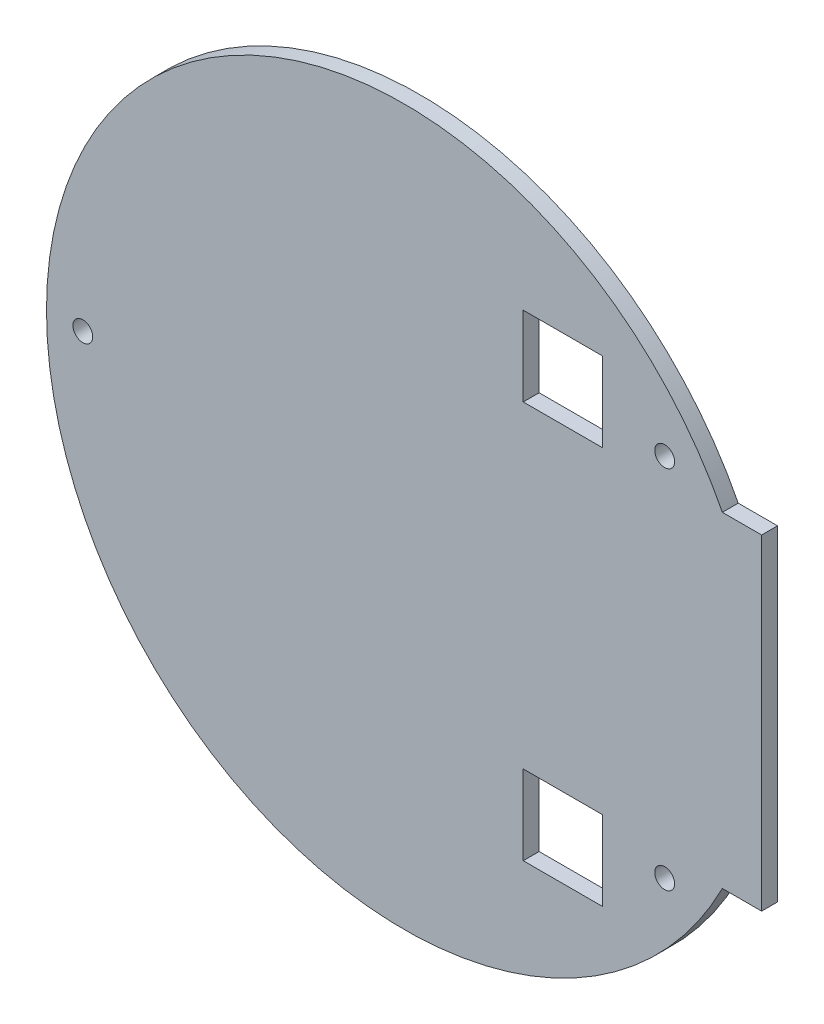
ISO-10303-21;
HEADER;
FILE_DESCRIPTION(('STEP AP214'),'2;1');
FILE_NAME('part.step','',(''),(''),'','','');
FILE_SCHEMA(('AUTOMOTIVE_DESIGN { 1 0 10303 214 1 1 1 1 }'));
ENDSEC;
DATA;
#1=APPLICATION_CONTEXT('core data for automotive mechanical design processes');
#2=APPLICATION_PROTOCOL_DEFINITION('international standard','automotive_design',2000,#1);
#3=PRODUCT_CONTEXT('',#1,'mechanical');
#4=PRODUCT('Part','Part','',(#3));
#5=PRODUCT_RELATED_PRODUCT_CATEGORY('part','',(#4));
#6=PRODUCT_DEFINITION_FORMATION('','',#4);
#7=PRODUCT_DEFINITION_CONTEXT('part definition',#1,'design');
#8=PRODUCT_DEFINITION('design','',#6,#7);
#9=PRODUCT_DEFINITION_SHAPE('','',#8);
#10=(LENGTH_UNIT() NAMED_UNIT(*) SI_UNIT(.MILLI.,.METRE.));
#11=(NAMED_UNIT(*) PLANE_ANGLE_UNIT() SI_UNIT($,.RADIAN.));
#12=(NAMED_UNIT(*) SI_UNIT($,.STERADIAN.) SOLID_ANGLE_UNIT());
#13=UNCERTAINTY_MEASURE_WITH_UNIT(LENGTH_MEASURE(1.E-05),#10,'distance_accuracy_value','');
#14=(GEOMETRIC_REPRESENTATION_CONTEXT(3) GLOBAL_UNCERTAINTY_ASSIGNED_CONTEXT((#13)) GLOBAL_UNIT_ASSIGNED_CONTEXT((#10,
#11,#12)) REPRESENTATION_CONTEXT('',''));
#15=CARTESIAN_POINT('',(0.,0.,0.));
#16=DIRECTION('',(0.,0.,1.));
#17=DIRECTION('',(1.,0.,0.));
#18=AXIS2_PLACEMENT_3D('',#15,#16,#17);
#19=CARTESIAN_POINT('',(0.,0.,2.));
#20=DIRECTION('',(0.,0.,1.));
#21=DIRECTION('',(1.,0.,0.));
#22=AXIS2_PLACEMENT_3D('',#19,#20,#21);
#23=PLANE('',#22);
#24=CARTESIAN_POINT('',(32.7988095050625,-23.,2.));
#25=DIRECTION('',(0.,0.,1.));
#26=DIRECTION('',(1.,0.,0.));
#27=AXIS2_PLACEMENT_3D('',#24,#25,#26);
#28=CIRCLE('',#27,1.25);
#29=CARTESIAN_POINT('',(34.0488095050625,-23.,2.));
#30=VERTEX_POINT('',#29);
#31=EDGE_CURVE('E195',#30,#30,#28,.T.);
#32=ORIENTED_EDGE('',*,*,#31,.F.);
#33=EDGE_LOOP('',(#32));
#34=FACE_BOUND('',#33,.T.);
#35=DIRECTION('',(0.,1.,0.));
#36=VECTOR('',#35,1.);
#37=CARTESIAN_POINT('',(45.,-20.5,2.));
#38=LINE('',#37,#36);
#39=CARTESIAN_POINT('',(45.,-20.5,2.));
#40=VERTEX_POINT('',#39);
#41=CARTESIAN_POINT('',(45.,20.5,2.));
#42=VERTEX_POINT('',#41);
#43=EDGE_CURVE('E207',#40,#42,#38,.T.);
#44=ORIENTED_EDGE('',*,*,#43,.T.);
#45=DIRECTION('',(-1.,0.,0.));
#46=VECTOR('',#45,1.);
#47=CARTESIAN_POINT('',(45.,20.5,2.));
#48=LINE('',#47,#46);
#49=CARTESIAN_POINT('',(40.0593309979086,20.5,2.));
#50=VERTEX_POINT('',#49);
#51=EDGE_CURVE('E210',#42,#50,#48,.T.);
#52=ORIENTED_EDGE('',*,*,#51,.T.);
#53=CARTESIAN_POINT('',(0.,0.,2.));
#54=DIRECTION('',(0.,0.,1.));
#55=DIRECTION('',(1.,0.,0.));
#56=AXIS2_PLACEMENT_3D('',#53,#54,#55);
#57=CIRCLE('',#56,45.);
#58=CARTESIAN_POINT('',(40.0593309979086,-20.5,2.));
#59=VERTEX_POINT('',#58);
#60=EDGE_CURVE('E213',#50,#59,#57,.T.);
#61=ORIENTED_EDGE('',*,*,#60,.T.);
#62=DIRECTION('',(1.,0.,0.));
#63=VECTOR('',#62,1.);
#64=CARTESIAN_POINT('',(40.0593309979086,-20.5,2.));
#65=LINE('',#64,#63);
#66=EDGE_CURVE('E215',#59,#40,#65,.T.);
#67=ORIENTED_EDGE('',*,*,#66,.T.);
#68=EDGE_LOOP('',(#44,#52,#61,#67));
#69=FACE_BOUND('',#68,.T.);
#70=CARTESIAN_POINT('',(-40.4272640637626,0.,2.));
#71=DIRECTION('',(0.,0.,1.));
#72=DIRECTION('',(1.,0.,0.));
#73=AXIS2_PLACEMENT_3D('',#70,#71,#72);
#74=CIRCLE('',#73,1.25);
#75=CARTESIAN_POINT('',(-39.1772640637626,0.,2.));
#76=VERTEX_POINT('',#75);
#77=EDGE_CURVE('E201',#76,#76,#74,.T.);
#78=ORIENTED_EDGE('',*,*,#77,.F.);
#79=EDGE_LOOP('',(#78));
#80=FACE_BOUND('',#79,.T.);
#81=CARTESIAN_POINT('',(32.7988095050625,23.,2.));
#82=DIRECTION('',(0.,0.,1.));
#83=DIRECTION('',(1.,0.,0.));
#84=AXIS2_PLACEMENT_3D('',#81,#82,#83);
#85=CIRCLE('',#84,1.25);
#86=CARTESIAN_POINT('',(34.0488095050625,23.,2.));
#87=VERTEX_POINT('',#86);
#88=EDGE_CURVE('E189',#87,#87,#85,.T.);
#89=ORIENTED_EDGE('',*,*,#88,.F.);
#90=EDGE_LOOP('',(#89));
#91=FACE_BOUND('',#90,.T.);
#92=DIRECTION('',(1.,0.,0.));
#93=VECTOR('',#92,1.);
#94=CARTESIAN_POINT('',(25.,20.,2.));
#95=LINE('',#94,#93);
#96=CARTESIAN_POINT('',(15.,20.,2.));
#97=VERTEX_POINT('',#96);
#98=CARTESIAN_POINT('',(25.,20.,2.));
#99=VERTEX_POINT('',#98);
#100=EDGE_CURVE('E160',#97,#99,#95,.T.);
#101=ORIENTED_EDGE('',*,*,#100,.F.);
#102=DIRECTION('',(0.,-1.,0.));
#103=VECTOR('',#102,1.);
#104=CARTESIAN_POINT('',(15.,20.,2.));
#105=LINE('',#104,#103);
#106=CARTESIAN_POINT('',(15.,30.,2.));
#107=VERTEX_POINT('',#106);
#108=EDGE_CURVE('E158',#107,#97,#105,.T.);
#109=ORIENTED_EDGE('',*,*,#108,.F.);
#110=DIRECTION('',(-1.,0.,0.));
#111=VECTOR('',#110,1.);
#112=CARTESIAN_POINT('',(25.,30.,2.));
#113=LINE('',#112,#111);
#114=CARTESIAN_POINT('',(25.,30.,2.));
#115=VERTEX_POINT('',#114);
#116=EDGE_CURVE('E166',#115,#107,#113,.T.);
#117=ORIENTED_EDGE('',*,*,#116,.F.);
#118=DIRECTION('',(0.,1.,0.));
#119=VECTOR('',#118,1.);
#120=CARTESIAN_POINT('',(25.,20.,2.));
#121=LINE('',#120,#119);
#122=EDGE_CURVE('E163',#99,#115,#121,.T.);
#123=ORIENTED_EDGE('',*,*,#122,.F.);
#124=EDGE_LOOP('',(#101,#109,#117,#123));
#125=FACE_BOUND('',#124,.T.);
#126=DIRECTION('',(-1.,0.,0.));
#127=VECTOR('',#126,1.);
#128=CARTESIAN_POINT('',(25.,-20.,2.));
#129=LINE('',#128,#127);
#130=CARTESIAN_POINT('',(25.,-20.,2.));
#131=VERTEX_POINT('',#130);
#132=CARTESIAN_POINT('',(15.,-20.,2.));
#133=VERTEX_POINT('',#132);
#134=EDGE_CURVE('E130',#131,#133,#129,.T.);
#135=ORIENTED_EDGE('',*,*,#134,.F.);
#136=DIRECTION('',(0.,1.,0.));
#137=VECTOR('',#136,1.);
#138=CARTESIAN_POINT('',(25.,-20.,2.));
#139=LINE('',#138,#137);
#140=CARTESIAN_POINT('',(25.,-30.,2.));
#141=VERTEX_POINT('',#140);
#142=EDGE_CURVE('E122',#141,#131,#139,.T.);
#143=ORIENTED_EDGE('',*,*,#142,.F.);
#144=DIRECTION('',(1.,0.,0.));
#145=VECTOR('',#144,1.);
#146=CARTESIAN_POINT('',(25.,-30.,2.));
#147=LINE('',#146,#145);
#148=CARTESIAN_POINT('',(15.,-30.,2.));
#149=VERTEX_POINT('',#148);
#150=EDGE_CURVE('E144',#149,#141,#147,.T.);
#151=ORIENTED_EDGE('',*,*,#150,.F.);
#152=DIRECTION('',(0.,-1.,0.));
#153=VECTOR('',#152,1.);
#154=CARTESIAN_POINT('',(15.,-20.,2.));
#155=LINE('',#154,#153);
#156=EDGE_CURVE('E142',#133,#149,#155,.T.);
#157=ORIENTED_EDGE('',*,*,#156,.F.);
#158=EDGE_LOOP('',(#135,#143,#151,#157));
#159=FACE_BOUND('',#158,.T.);
#160=ADVANCED_FACE('F33',(#34,#69,#80,#91,#125,#159),#23,.T.);
#161=CARTESIAN_POINT('',(0.,0.,0.));
#162=DIRECTION('',(0.,0.,1.));
#163=DIRECTION('',(1.,0.,0.));
#164=AXIS2_PLACEMENT_3D('',#161,#162,#163);
#165=PLANE('',#164);
#166=DIRECTION('',(0.,-1.,0.));
#167=VECTOR('',#166,1.);
#168=CARTESIAN_POINT('',(15.,20.,0.));
#169=LINE('',#168,#167);
#170=CARTESIAN_POINT('',(15.,30.,0.));
#171=VERTEX_POINT('',#170);
#172=CARTESIAN_POINT('',(15.,20.,0.));
#173=VERTEX_POINT('',#172);
#174=EDGE_CURVE('E138',#171,#173,#169,.T.);
#175=ORIENTED_EDGE('',*,*,#174,.T.);
#176=DIRECTION('',(1.,0.,0.));
#177=VECTOR('',#176,1.);
#178=CARTESIAN_POINT('',(25.,20.,0.));
#179=LINE('',#178,#177);
#180=CARTESIAN_POINT('',(25.,20.,0.));
#181=VERTEX_POINT('',#180);
#182=EDGE_CURVE('E171',#173,#181,#179,.T.);
#183=ORIENTED_EDGE('',*,*,#182,.T.);
#184=DIRECTION('',(0.,1.,0.));
#185=VECTOR('',#184,1.);
#186=CARTESIAN_POINT('',(25.,20.,0.));
#187=LINE('',#186,#185);
#188=CARTESIAN_POINT('',(25.,30.,0.));
#189=VERTEX_POINT('',#188);
#190=EDGE_CURVE('E174',#181,#189,#187,.T.);
#191=ORIENTED_EDGE('',*,*,#190,.T.);
#192=DIRECTION('',(-1.,0.,0.));
#193=VECTOR('',#192,1.);
#194=CARTESIAN_POINT('',(25.,30.,0.));
#195=LINE('',#194,#193);
#196=EDGE_CURVE('E161',#189,#171,#195,.T.);
#197=ORIENTED_EDGE('',*,*,#196,.T.);
#198=EDGE_LOOP('',(#175,#183,#191,#197));
#199=FACE_BOUND('',#198,.T.);
#200=DIRECTION('',(0.,1.,0.));
#201=VECTOR('',#200,1.);
#202=CARTESIAN_POINT('',(45.,-20.5,0.));
#203=LINE('',#202,#201);
#204=CARTESIAN_POINT('',(45.,-20.5,0.));
#205=VERTEX_POINT('',#204);
#206=CARTESIAN_POINT('',(45.,20.5,0.));
#207=VERTEX_POINT('',#206);
#208=EDGE_CURVE('E204',#205,#207,#203,.T.);
#209=ORIENTED_EDGE('',*,*,#208,.F.);
#210=DIRECTION('',(1.,0.,0.));
#211=VECTOR('',#210,1.);
#212=CARTESIAN_POINT('',(40.0593309979086,-20.5,0.));
#213=LINE('',#212,#211);
#214=CARTESIAN_POINT('',(40.0593309979086,-20.5,0.));
#215=VERTEX_POINT('',#214);
#216=EDGE_CURVE('E211',#215,#205,#213,.T.);
#217=ORIENTED_EDGE('',*,*,#216,.F.);
#218=CARTESIAN_POINT('',(0.,0.,0.));
#219=DIRECTION('',(0.,0.,1.));
#220=DIRECTION('',(1.,0.,0.));
#221=AXIS2_PLACEMENT_3D('',#218,#219,#220);
#222=CIRCLE('',#221,45.);
#223=CARTESIAN_POINT('',(40.0593309979086,20.5,0.));
#224=VERTEX_POINT('',#223);
#225=EDGE_CURVE('E222',#224,#215,#222,.T.);
#226=ORIENTED_EDGE('',*,*,#225,.F.);
#227=DIRECTION('',(-1.,0.,0.));
#228=VECTOR('',#227,1.);
#229=CARTESIAN_POINT('',(45.,20.5,0.));
#230=LINE('',#229,#228);
#231=EDGE_CURVE('E220',#207,#224,#230,.T.);
#232=ORIENTED_EDGE('',*,*,#231,.F.);
#233=EDGE_LOOP('',(#209,#217,#226,#232));
#234=FACE_BOUND('',#233,.T.);
#235=CARTESIAN_POINT('',(-40.4272640637626,0.,0.));
#236=DIRECTION('',(0.,0.,1.));
#237=DIRECTION('',(1.,0.,0.));
#238=AXIS2_PLACEMENT_3D('',#235,#236,#237);
#239=CIRCLE('',#238,1.25);
#240=CARTESIAN_POINT('',(-39.1772640637626,0.,0.));
#241=VERTEX_POINT('',#240);
#242=EDGE_CURVE('E198',#241,#241,#239,.T.);
#243=ORIENTED_EDGE('',*,*,#242,.T.);
#244=EDGE_LOOP('',(#243));
#245=FACE_BOUND('',#244,.T.);
#246=CARTESIAN_POINT('',(32.7988095050625,-23.,0.));
#247=DIRECTION('',(0.,0.,1.));
#248=DIRECTION('',(1.,0.,0.));
#249=AXIS2_PLACEMENT_3D('',#246,#247,#248);
#250=CIRCLE('',#249,1.25);
#251=CARTESIAN_POINT('',(34.0488095050625,-23.,0.));
#252=VERTEX_POINT('',#251);
#253=EDGE_CURVE('E192',#252,#252,#250,.T.);
#254=ORIENTED_EDGE('',*,*,#253,.T.);
#255=EDGE_LOOP('',(#254));
#256=FACE_BOUND('',#255,.T.);
#257=CARTESIAN_POINT('',(32.7988095050625,23.,0.));
#258=DIRECTION('',(0.,0.,1.));
#259=DIRECTION('',(1.,0.,0.));
#260=AXIS2_PLACEMENT_3D('',#257,#258,#259);
#261=CIRCLE('',#260,1.25);
#262=CARTESIAN_POINT('',(34.0488095050625,23.,0.));
#263=VERTEX_POINT('',#262);
#264=EDGE_CURVE('E188',#263,#263,#261,.T.);
#265=ORIENTED_EDGE('',*,*,#264,.T.);
#266=EDGE_LOOP('',(#265));
#267=FACE_BOUND('',#266,.T.);
#268=DIRECTION('',(0.,1.,0.));
#269=VECTOR('',#268,1.);
#270=CARTESIAN_POINT('',(25.,-20.,0.));
#271=LINE('',#270,#269);
#272=CARTESIAN_POINT('',(25.,-30.,0.));
#273=VERTEX_POINT('',#272);
#274=CARTESIAN_POINT('',(25.,-20.,0.));
#275=VERTEX_POINT('',#274);
#276=EDGE_CURVE('E56',#273,#275,#271,.T.);
#277=ORIENTED_EDGE('',*,*,#276,.T.);
#278=DIRECTION('',(-1.,0.,0.));
#279=VECTOR('',#278,1.);
#280=CARTESIAN_POINT('',(25.,-20.,0.));
#281=LINE('',#280,#279);
#282=CARTESIAN_POINT('',(15.,-20.,0.));
#283=VERTEX_POINT('',#282);
#284=EDGE_CURVE('E137',#275,#283,#281,.T.);
#285=ORIENTED_EDGE('',*,*,#284,.T.);
#286=DIRECTION('',(0.,-1.,0.));
#287=VECTOR('',#286,1.);
#288=CARTESIAN_POINT('',(15.,-20.,0.));
#289=LINE('',#288,#287);
#290=CARTESIAN_POINT('',(15.,-30.,0.));
#291=VERTEX_POINT('',#290);
#292=EDGE_CURVE('E150',#283,#291,#289,.T.);
#293=ORIENTED_EDGE('',*,*,#292,.T.);
#294=DIRECTION('',(1.,0.,0.));
#295=VECTOR('',#294,1.);
#296=CARTESIAN_POINT('',(25.,-30.,0.));
#297=LINE('',#296,#295);
#298=EDGE_CURVE('E131',#291,#273,#297,.T.);
#299=ORIENTED_EDGE('',*,*,#298,.T.);
#300=EDGE_LOOP('',(#277,#285,#293,#299));
#301=FACE_BOUND('',#300,.T.);
#302=ADVANCED_FACE('F240',(#199,#234,#245,#256,#267,#301),#165,.F.);
#303=CARTESIAN_POINT('',(45.,-20.5,2.));
#304=DIRECTION('',(-1.,0.,0.));
#305=DIRECTION('',(0.,0.,1.));
#306=AXIS2_PLACEMENT_3D('',#303,#304,#305);
#307=PLANE('',#306);
#308=ORIENTED_EDGE('',*,*,#208,.T.);
#309=DIRECTION('',(0.,0.,-1.));
#310=VECTOR('',#309,1.);
#311=CARTESIAN_POINT('',(45.,20.5,2.));
#312=LINE('',#311,#310);
#313=EDGE_CURVE('E11',#42,#207,#312,.T.);
#314=ORIENTED_EDGE('',*,*,#313,.F.);
#315=ORIENTED_EDGE('',*,*,#43,.F.);
#316=DIRECTION('',(0.,0.,-1.));
#317=VECTOR('',#316,1.);
#318=CARTESIAN_POINT('',(45.,-20.5,2.));
#319=LINE('',#318,#317);
#320=EDGE_CURVE('E217',#40,#205,#319,.T.);
#321=ORIENTED_EDGE('',*,*,#320,.T.);
#322=EDGE_LOOP('',(#308,#314,#315,#321));
#323=FACE_BOUND('',#322,.T.);
#324=ADVANCED_FACE('F35',(#323),#307,.F.);
#325=CARTESIAN_POINT('',(45.,20.5,2.));
#326=DIRECTION('',(0.,-1.,0.));
#327=DIRECTION('',(0.,0.,-1.));
#328=AXIS2_PLACEMENT_3D('',#325,#326,#327);
#329=PLANE('',#328);
#330=ORIENTED_EDGE('',*,*,#231,.T.);
#331=DIRECTION('',(0.,0.,-1.));
#332=VECTOR('',#331,1.);
#333=CARTESIAN_POINT('',(40.0593309979086,20.5,2.));
#334=LINE('',#333,#332);
#335=EDGE_CURVE('E41',#50,#224,#334,.T.);
#336=ORIENTED_EDGE('',*,*,#335,.F.);
#337=ORIENTED_EDGE('',*,*,#51,.F.);
#338=ORIENTED_EDGE('',*,*,#313,.T.);
#339=EDGE_LOOP('',(#330,#336,#337,#338));
#340=FACE_BOUND('',#339,.T.);
#341=ADVANCED_FACE('F251',(#340),#329,.F.);
#342=CARTESIAN_POINT('',(0.,0.,2.));
#343=DIRECTION('',(0.,0.,-1.));
#344=DIRECTION('',(-1.,0.,0.));
#345=AXIS2_PLACEMENT_3D('',#342,#343,#344);
#346=CYLINDRICAL_SURFACE('',#345,45.);
#347=ORIENTED_EDGE('',*,*,#225,.T.);
#348=DIRECTION('',(0.,0.,-1.));
#349=VECTOR('',#348,1.);
#350=CARTESIAN_POINT('',(40.0593309979086,-20.5,2.));
#351=LINE('',#350,#349);
#352=EDGE_CURVE('E227',#59,#215,#351,.T.);
#353=ORIENTED_EDGE('',*,*,#352,.F.);
#354=ORIENTED_EDGE('',*,*,#60,.F.);
#355=ORIENTED_EDGE('',*,*,#335,.T.);
#356=EDGE_LOOP('',(#347,#353,#354,#355));
#357=FACE_BOUND('',#356,.T.);
#358=ADVANCED_FACE('F234',(#357),#346,.T.);
#359=CARTESIAN_POINT('',(40.0593309979086,-20.5,2.));
#360=DIRECTION('',(0.,1.,0.));
#361=DIRECTION('',(0.,0.,1.));
#362=AXIS2_PLACEMENT_3D('',#359,#360,#361);
#363=PLANE('',#362);
#364=ORIENTED_EDGE('',*,*,#216,.T.);
#365=ORIENTED_EDGE('',*,*,#320,.F.);
#366=ORIENTED_EDGE('',*,*,#66,.F.);
#367=ORIENTED_EDGE('',*,*,#352,.T.);
#368=EDGE_LOOP('',(#364,#365,#366,#367));
#369=FACE_BOUND('',#368,.T.);
#370=ADVANCED_FACE('F244',(#369),#363,.F.);
#371=CARTESIAN_POINT('',(-40.4272640637626,0.,2.));
#372=DIRECTION('',(0.,0.,-1.));
#373=DIRECTION('',(-1.,0.,0.));
#374=AXIS2_PLACEMENT_3D('',#371,#372,#373);
#375=CYLINDRICAL_SURFACE('',#374,1.25);
#376=ORIENTED_EDGE('',*,*,#77,.T.);
#377=EDGE_LOOP('',(#376));
#378=FACE_BOUND('',#377,.T.);
#379=ORIENTED_EDGE('',*,*,#242,.F.);
#380=EDGE_LOOP('',(#379));
#381=FACE_BOUND('',#380,.T.);
#382=ADVANCED_FACE('F268',(#378,#381),#375,.F.);
#383=CARTESIAN_POINT('',(32.7988095050625,-23.,2.));
#384=DIRECTION('',(0.,0.,-1.));
#385=DIRECTION('',(-1.,0.,0.));
#386=AXIS2_PLACEMENT_3D('',#383,#384,#385);
#387=CYLINDRICAL_SURFACE('',#386,1.25);
#388=ORIENTED_EDGE('',*,*,#31,.T.);
#389=EDGE_LOOP('',(#388));
#390=FACE_BOUND('',#389,.T.);
#391=ORIENTED_EDGE('',*,*,#253,.F.);
#392=EDGE_LOOP('',(#391));
#393=FACE_BOUND('',#392,.T.);
#394=ADVANCED_FACE('F275',(#390,#393),#387,.F.);
#395=CARTESIAN_POINT('',(32.7988095050625,23.,2.));
#396=DIRECTION('',(0.,0.,-1.));
#397=DIRECTION('',(-1.,0.,0.));
#398=AXIS2_PLACEMENT_3D('',#395,#396,#397);
#399=CYLINDRICAL_SURFACE('',#398,1.25);
#400=ORIENTED_EDGE('',*,*,#88,.T.);
#401=EDGE_LOOP('',(#400));
#402=FACE_BOUND('',#401,.T.);
#403=ORIENTED_EDGE('',*,*,#264,.F.);
#404=EDGE_LOOP('',(#403));
#405=FACE_BOUND('',#404,.T.);
#406=ADVANCED_FACE('F280',(#402,#405),#399,.F.);
#407=CARTESIAN_POINT('',(15.,20.,2.));
#408=DIRECTION('',(1.,0.,0.));
#409=DIRECTION('',(0.,0.,-1.));
#410=AXIS2_PLACEMENT_3D('',#407,#408,#409);
#411=PLANE('',#410);
#412=ORIENTED_EDGE('',*,*,#174,.F.);
#413=DIRECTION('',(0.,0.,-1.));
#414=VECTOR('',#413,1.);
#415=CARTESIAN_POINT('',(15.,30.,2.));
#416=LINE('',#415,#414);
#417=EDGE_CURVE('E168',#107,#171,#416,.T.);
#418=ORIENTED_EDGE('',*,*,#417,.F.);
#419=ORIENTED_EDGE('',*,*,#108,.T.);
#420=DIRECTION('',(0.,0.,-1.));
#421=VECTOR('',#420,1.);
#422=CARTESIAN_POINT('',(15.,20.,2.));
#423=LINE('',#422,#421);
#424=EDGE_CURVE('E185',#97,#173,#423,.T.);
#425=ORIENTED_EDGE('',*,*,#424,.T.);
#426=EDGE_LOOP('',(#412,#418,#419,#425));
#427=FACE_BOUND('',#426,.T.);
#428=ADVANCED_FACE('F316',(#427),#411,.T.);
#429=CARTESIAN_POINT('',(25.,20.,2.));
#430=DIRECTION('',(0.,1.,0.));
#431=DIRECTION('',(0.,0.,1.));
#432=AXIS2_PLACEMENT_3D('',#429,#430,#431);
#433=PLANE('',#432);
#434=ORIENTED_EDGE('',*,*,#182,.F.);
#435=ORIENTED_EDGE('',*,*,#424,.F.);
#436=ORIENTED_EDGE('',*,*,#100,.T.);
#437=DIRECTION('',(0.,0.,-1.));
#438=VECTOR('',#437,1.);
#439=CARTESIAN_POINT('',(25.,20.,2.));
#440=LINE('',#439,#438);
#441=EDGE_CURVE('E183',#99,#181,#440,.T.);
#442=ORIENTED_EDGE('',*,*,#441,.T.);
#443=EDGE_LOOP('',(#434,#435,#436,#442));
#444=FACE_BOUND('',#443,.T.);
#445=ADVANCED_FACE('F312',(#444),#433,.T.);
#446=CARTESIAN_POINT('',(25.,20.,2.));
#447=DIRECTION('',(-1.,0.,0.));
#448=DIRECTION('',(0.,0.,1.));
#449=AXIS2_PLACEMENT_3D('',#446,#447,#448);
#450=PLANE('',#449);
#451=ORIENTED_EDGE('',*,*,#190,.F.);
#452=ORIENTED_EDGE('',*,*,#441,.F.);
#453=ORIENTED_EDGE('',*,*,#122,.T.);
#454=DIRECTION('',(0.,0.,-1.));
#455=VECTOR('',#454,1.);
#456=CARTESIAN_POINT('',(25.,30.,2.));
#457=LINE('',#456,#455);
#458=EDGE_CURVE('E181',#115,#189,#457,.T.);
#459=ORIENTED_EDGE('',*,*,#458,.T.);
#460=EDGE_LOOP('',(#451,#452,#453,#459));
#461=FACE_BOUND('',#460,.T.);
#462=ADVANCED_FACE('F308',(#461),#450,.T.);
#463=CARTESIAN_POINT('',(25.,30.,2.));
#464=DIRECTION('',(0.,-1.,0.));
#465=DIRECTION('',(0.,0.,-1.));
#466=AXIS2_PLACEMENT_3D('',#463,#464,#465);
#467=PLANE('',#466);
#468=ORIENTED_EDGE('',*,*,#196,.F.);
#469=ORIENTED_EDGE('',*,*,#458,.F.);
#470=ORIENTED_EDGE('',*,*,#116,.T.);
#471=ORIENTED_EDGE('',*,*,#417,.T.);
#472=EDGE_LOOP('',(#468,#469,#470,#471));
#473=FACE_BOUND('',#472,.T.);
#474=ADVANCED_FACE('F305',(#473),#467,.T.);
#475=CARTESIAN_POINT('',(25.,-20.,2.));
#476=DIRECTION('',(-1.,0.,0.));
#477=DIRECTION('',(0.,0.,1.));
#478=AXIS2_PLACEMENT_3D('',#475,#476,#477);
#479=PLANE('',#478);
#480=ORIENTED_EDGE('',*,*,#276,.F.);
#481=DIRECTION('',(0.,0.,-1.));
#482=VECTOR('',#481,1.);
#483=CARTESIAN_POINT('',(25.,-30.,2.));
#484=LINE('',#483,#482);
#485=EDGE_CURVE('E126',#141,#273,#484,.T.);
#486=ORIENTED_EDGE('',*,*,#485,.F.);
#487=ORIENTED_EDGE('',*,*,#142,.T.);
#488=DIRECTION('',(0.,0.,-1.));
#489=VECTOR('',#488,1.);
#490=CARTESIAN_POINT('',(25.,-20.,2.));
#491=LINE('',#490,#489);
#492=EDGE_CURVE('E125',#131,#275,#491,.T.);
#493=ORIENTED_EDGE('',*,*,#492,.T.);
#494=EDGE_LOOP('',(#480,#486,#487,#493));
#495=FACE_BOUND('',#494,.T.);
#496=ADVANCED_FACE('F124',(#495),#479,.T.);
#497=CARTESIAN_POINT('',(25.,-20.,2.));
#498=DIRECTION('',(0.,-1.,0.));
#499=DIRECTION('',(0.,0.,-1.));
#500=AXIS2_PLACEMENT_3D('',#497,#498,#499);
#501=PLANE('',#500);
#502=ORIENTED_EDGE('',*,*,#284,.F.);
#503=ORIENTED_EDGE('',*,*,#492,.F.);
#504=ORIENTED_EDGE('',*,*,#134,.T.);
#505=DIRECTION('',(0.,0.,-1.));
#506=VECTOR('',#505,1.);
#507=CARTESIAN_POINT('',(15.,-20.,2.));
#508=LINE('',#507,#506);
#509=EDGE_CURVE('E139',#133,#283,#508,.T.);
#510=ORIENTED_EDGE('',*,*,#509,.T.);
#511=EDGE_LOOP('',(#502,#503,#504,#510));
#512=FACE_BOUND('',#511,.T.);
#513=ADVANCED_FACE('F134',(#512),#501,.T.);
#514=CARTESIAN_POINT('',(15.,-20.,2.));
#515=DIRECTION('',(1.,0.,0.));
#516=DIRECTION('',(0.,0.,-1.));
#517=AXIS2_PLACEMENT_3D('',#514,#515,#516);
#518=PLANE('',#517);
#519=ORIENTED_EDGE('',*,*,#292,.F.);
#520=ORIENTED_EDGE('',*,*,#509,.F.);
#521=ORIENTED_EDGE('',*,*,#156,.T.);
#522=DIRECTION('',(0.,0.,-1.));
#523=VECTOR('',#522,1.);
#524=CARTESIAN_POINT('',(15.,-30.,2.));
#525=LINE('',#524,#523);
#526=EDGE_CURVE('E48',#149,#291,#525,.T.);
#527=ORIENTED_EDGE('',*,*,#526,.T.);
#528=EDGE_LOOP('',(#519,#520,#521,#527));
#529=FACE_BOUND('',#528,.T.);
#530=ADVANCED_FACE('F293',(#529),#518,.T.);
#531=CARTESIAN_POINT('',(25.,-30.,2.));
#532=DIRECTION('',(0.,1.,0.));
#533=DIRECTION('',(0.,0.,1.));
#534=AXIS2_PLACEMENT_3D('',#531,#532,#533);
#535=PLANE('',#534);
#536=ORIENTED_EDGE('',*,*,#298,.F.);
#537=ORIENTED_EDGE('',*,*,#526,.F.);
#538=ORIENTED_EDGE('',*,*,#150,.T.);
#539=ORIENTED_EDGE('',*,*,#485,.T.);
#540=EDGE_LOOP('',(#536,#537,#538,#539));
#541=FACE_BOUND('',#540,.T.);
#542=ADVANCED_FACE('F291',(#541),#535,.T.);
#543=CLOSED_SHELL('',(#160,#302,#324,#341,#358,#370,#382,#394,#406,#428,#445,#462,#474,#496,
#513,#530,#542));
#544=MANIFOLD_SOLID_BREP('B2',#543);
#545=ADVANCED_BREP_SHAPE_REPRESENTATION('',(#18,#544),#14);
#546=SHAPE_DEFINITION_REPRESENTATION(#9,#545);
ENDSEC;
END-ISO-10303-21;
